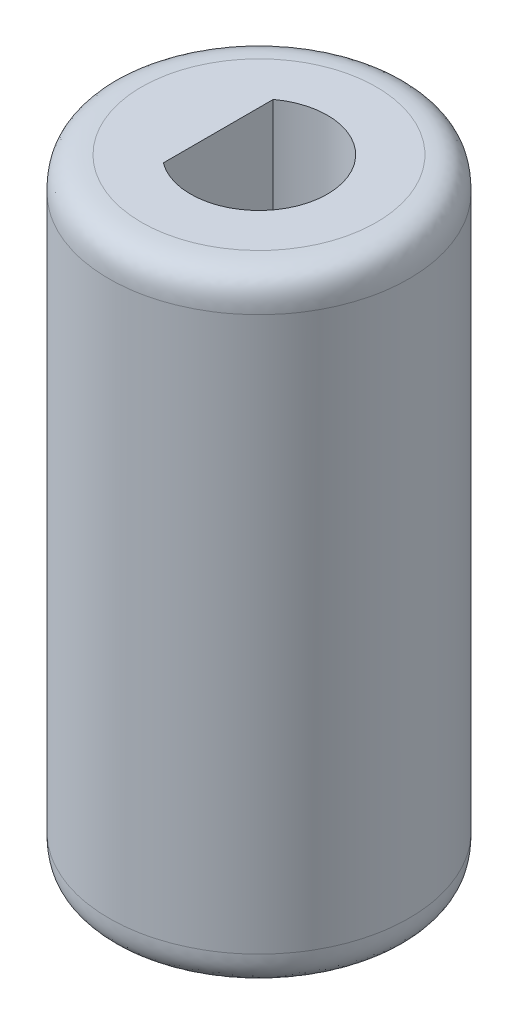
ISO-10303-21;
HEADER;
FILE_DESCRIPTION(('STEP AP214'),'2;1');
FILE_NAME('part.step','',(''),(''),'','','');
FILE_SCHEMA(('AUTOMOTIVE_DESIGN { 1 0 10303 214 1 1 1 1 }'));
ENDSEC;
DATA;
#1=APPLICATION_CONTEXT('core data for automotive mechanical design processes');
#2=APPLICATION_PROTOCOL_DEFINITION('international standard','automotive_design',2000,#1);
#3=PRODUCT_CONTEXT('',#1,'mechanical');
#4=PRODUCT('Part','Part','',(#3));
#5=PRODUCT_RELATED_PRODUCT_CATEGORY('part','',(#4));
#6=PRODUCT_DEFINITION_FORMATION('','',#4);
#7=PRODUCT_DEFINITION_CONTEXT('part definition',#1,'design');
#8=PRODUCT_DEFINITION('design','',#6,#7);
#9=PRODUCT_DEFINITION_SHAPE('','',#8);
#10=(LENGTH_UNIT() NAMED_UNIT(*) SI_UNIT(.MILLI.,.METRE.));
#11=(NAMED_UNIT(*) PLANE_ANGLE_UNIT() SI_UNIT($,.RADIAN.));
#12=(NAMED_UNIT(*) SI_UNIT($,.STERADIAN.) SOLID_ANGLE_UNIT());
#13=UNCERTAINTY_MEASURE_WITH_UNIT(LENGTH_MEASURE(1.E-05),#10,'distance_accuracy_value','');
#14=(GEOMETRIC_REPRESENTATION_CONTEXT(3) GLOBAL_UNCERTAINTY_ASSIGNED_CONTEXT((#13)) GLOBAL_UNIT_ASSIGNED_CONTEXT((#10,
#11,#12)) REPRESENTATION_CONTEXT('',''));
#15=CARTESIAN_POINT('',(0.,0.,0.));
#16=DIRECTION('',(0.,0.,1.));
#17=DIRECTION('',(1.,0.,0.));
#18=AXIS2_PLACEMENT_3D('',#15,#16,#17);
#19=CARTESIAN_POINT('',(0.,38.,0.));
#20=DIRECTION('',(0.,1.,0.));
#21=DIRECTION('',(-1.,0.,0.));
#22=AXIS2_PLACEMENT_3D('',#19,#20,#21);
#23=CYLINDRICAL_SURFACE('',#22,5.207);
#24=CARTESIAN_POINT('',(0.,0.,0.));
#25=DIRECTION('',(0.,1.,0.));
#26=DIRECTION('',(-1.,0.,0.));
#27=AXIS2_PLACEMENT_3D('',#24,#25,#26);
#28=CIRCLE('',#27,5.207);
#29=CARTESIAN_POINT('',(4.191,0.,-3.09004336539149));
#30=VERTEX_POINT('',#29);
#31=CARTESIAN_POINT('',(4.191,0.,3.09004336539149));
#32=VERTEX_POINT('',#31);
#33=EDGE_CURVE('E102',#30,#32,#28,.T.);
#34=ORIENTED_EDGE('',*,*,#33,.F.);
#35=DIRECTION('',(0.,1.,0.));
#36=VECTOR('',#35,1.);
#37=CARTESIAN_POINT('',(4.191,-6.26304462701648,-3.09004336539149));
#38=LINE('',#37,#36);
#39=CARTESIAN_POINT('',(4.191,18.,-3.09004336539149));
#40=VERTEX_POINT('',#39);
#41=EDGE_CURVE('E93',#30,#40,#38,.T.);
#42=ORIENTED_EDGE('',*,*,#41,.T.);
#43=CARTESIAN_POINT('',(0.,18.,0.));
#44=DIRECTION('',(0.,1.,0.));
#45=DIRECTION('',(-1.,0.,0.));
#46=AXIS2_PLACEMENT_3D('',#43,#44,#45);
#47=CIRCLE('',#46,5.207);
#48=CARTESIAN_POINT('',(4.191,18.,3.09004336539149));
#49=VERTEX_POINT('',#48);
#50=EDGE_CURVE('E104',#40,#49,#47,.T.);
#51=ORIENTED_EDGE('',*,*,#50,.T.);
#52=DIRECTION('',(0.,1.,0.));
#53=VECTOR('',#52,1.);
#54=CARTESIAN_POINT('',(4.191,-6.26304462701648,3.09004336539149));
#55=LINE('',#54,#53);
#56=EDGE_CURVE('E65',#32,#49,#55,.T.);
#57=ORIENTED_EDGE('',*,*,#56,.F.);
#58=EDGE_LOOP('',(#34,#42,#51,#57));
#59=FACE_BOUND('',#58,.T.);
#60=ADVANCED_FACE('F43',(#59),#23,.F.);
#61=CARTESIAN_POINT('',(-5.207,18.,0.));
#62=DIRECTION('',(0.,-1.,0.));
#63=DIRECTION('',(1.,0.,0.));
#64=AXIS2_PLACEMENT_3D('',#61,#62,#63);
#65=PLANE('',#64);
#66=ORIENTED_EDGE('',*,*,#50,.F.);
#67=DIRECTION('',(0.,0.,-1.));
#68=VECTOR('',#67,1.);
#69=CARTESIAN_POINT('',(4.191,18.,0.));
#70=LINE('',#69,#68);
#71=EDGE_CURVE('E98',#49,#40,#70,.T.);
#72=ORIENTED_EDGE('',*,*,#71,.F.);
#73=EDGE_LOOP('',(#66,#72));
#74=FACE_BOUND('',#73,.T.);
#75=ADVANCED_FACE('F147',(#74),#65,.T.);
#76=CARTESIAN_POINT('',(-4.2,20.,0.));
#77=DIRECTION('',(0.,1.,0.));
#78=DIRECTION('',(-1.,0.,0.));
#79=AXIS2_PLACEMENT_3D('',#76,#77,#78);
#80=PLANE('',#79);
#81=CARTESIAN_POINT('',(0.,20.,0.));
#82=DIRECTION('',(0.,1.,0.));
#83=DIRECTION('',(-1.,0.,0.));
#84=AXIS2_PLACEMENT_3D('',#81,#82,#83);
#85=CIRCLE('',#84,4.2);
#86=CARTESIAN_POINT('',(-2.5,20.,3.37490740613724));
#87=VERTEX_POINT('',#86);
#88=CARTESIAN_POINT('',(-2.5,20.,-3.37490740613724));
#89=VERTEX_POINT('',#88);
#90=EDGE_CURVE('E115',#87,#89,#85,.T.);
#91=ORIENTED_EDGE('',*,*,#90,.T.);
#92=DIRECTION('',(0.,0.,-1.));
#93=VECTOR('',#92,1.);
#94=CARTESIAN_POINT('',(-2.5,20.,-3.37490740613724));
#95=LINE('',#94,#93);
#96=EDGE_CURVE('E234',#87,#89,#95,.T.);
#97=ORIENTED_EDGE('',*,*,#96,.F.);
#98=EDGE_LOOP('',(#91,#97));
#99=FACE_BOUND('',#98,.T.);
#100=ADVANCED_FACE('F144',(#99),#80,.T.);
#101=CARTESIAN_POINT('',(0.,38.,0.));
#102=DIRECTION('',(0.,1.,0.));
#103=DIRECTION('',(-1.,0.,0.));
#104=AXIS2_PLACEMENT_3D('',#101,#102,#103);
#105=CYLINDRICAL_SURFACE('',#104,4.2);
#106=ORIENTED_EDGE('',*,*,#90,.F.);
#107=DIRECTION('',(0.,-1.,0.));
#108=VECTOR('',#107,1.);
#109=CARTESIAN_POINT('',(-2.5,44.9606034221179,3.37490740613724));
#110=LINE('',#109,#108);
#111=CARTESIAN_POINT('',(-2.5,38.,3.37490740613724));
#112=VERTEX_POINT('',#111);
#113=EDGE_CURVE('E230',#112,#87,#110,.T.);
#114=ORIENTED_EDGE('',*,*,#113,.F.);
#115=CARTESIAN_POINT('',(0.,38.,0.));
#116=DIRECTION('',(0.,1.,0.));
#117=DIRECTION('',(-1.,0.,0.));
#118=AXIS2_PLACEMENT_3D('',#115,#116,#117);
#119=CIRCLE('',#118,4.2);
#120=CARTESIAN_POINT('',(-2.5,38.,-3.37490740613724));
#121=VERTEX_POINT('',#120);
#122=EDGE_CURVE('E233',#112,#121,#119,.T.);
#123=ORIENTED_EDGE('',*,*,#122,.T.);
#124=DIRECTION('',(0.,-1.,0.));
#125=VECTOR('',#124,1.);
#126=CARTESIAN_POINT('',(-2.5,44.9606034221179,-3.37490740613724));
#127=LINE('',#126,#125);
#128=EDGE_CURVE('E73',#121,#89,#127,.T.);
#129=ORIENTED_EDGE('',*,*,#128,.T.);
#130=EDGE_LOOP('',(#106,#114,#123,#129));
#131=FACE_BOUND('',#130,.T.);
#132=ADVANCED_FACE('F141',(#131),#105,.F.);
#133=CARTESIAN_POINT('',(-9.207,0.,0.));
#134=DIRECTION('',(0.,-1.,0.));
#135=DIRECTION('',(1.,0.,0.));
#136=AXIS2_PLACEMENT_3D('',#133,#134,#135);
#137=PLANE('',#136);
#138=CARTESIAN_POINT('',(-7.207,0.,0.));
#139=CARTESIAN_POINT('',(-7.207,0.,0.943267144349957));
#140=CARTESIAN_POINT('',(-6.8317449984918,0.,2.82980143304989));
#141=CARTESIAN_POINT('',(-5.22879125013176,0.,5.22879125013175));
#142=CARTESIAN_POINT('',(-2.82980143304987,0.,6.83174499849181));
#143=CARTESIAN_POINT('',(0.,0.,7.3946275007541));
#144=CARTESIAN_POINT('',(2.82980143304986,0.,6.83174499849181));
#145=CARTESIAN_POINT('',(5.22879125013176,0.,5.22879125013176));
#146=CARTESIAN_POINT('',(6.83174499849181,0.,2.82980143304987));
#147=CARTESIAN_POINT('',(7.3946275007541,0.,0.));
#148=CARTESIAN_POINT('',(6.83174499849181,0.,-2.82980143304986));
#149=CARTESIAN_POINT('',(5.22879125013176,0.,-5.22879125013175));
#150=CARTESIAN_POINT('',(2.82980143304986,0.,-6.8317449984918));
#151=CARTESIAN_POINT('',(0.,0.,-7.3946275007541));
#152=CARTESIAN_POINT('',(-2.82980143304989,0.,-6.8317449984918));
#153=CARTESIAN_POINT('',(-5.22879125013174,0.,-5.22879125013177));
#154=CARTESIAN_POINT('',(-6.83174499849182,0.,-2.82980143304985));
#155=CARTESIAN_POINT('',(-7.20700000000001,0.,-0.943267144349954));
#156=CARTESIAN_POINT('',(-7.207,0.,0.));
#157=B_SPLINE_CURVE_WITH_KNOTS('',3,(#138,#139,#140,#141,#142,#143,#144,#145,#146,#147,#148,
#149,#150,#151,#152,#153,#154,#155,#156),.UNSPECIFIED.,.T.,.F.,(4,1,1,1,1,1,1,1,1,1,1,1,1,1,1,1,
4),(-3.14159265358979,-2.74889357189107,-2.35619449019234,-1.96349540849362,-1.5707963267949,
-1.17809724509617,-0.785398163397448,-0.392699081698724,0.,0.392699081698724,0.785398163397448,
1.17809724509617,1.5707963267949,1.96349540849362,2.35619449019235,2.74889357189107,
3.14159265358979),.UNSPECIFIED.);
#158=CARTESIAN_POINT('',(-7.207,0.,0.));
#159=VERTEX_POINT('',#158);
#160=EDGE_CURVE('E11',#159,#159,#157,.F.);
#161=ORIENTED_EDGE('',*,*,#160,.T.);
#162=EDGE_LOOP('',(#161));
#163=FACE_BOUND('',#162,.T.);
#164=ORIENTED_EDGE('',*,*,#33,.T.);
#165=DIRECTION('',(0.,0.,-1.));
#166=VECTOR('',#165,1.);
#167=CARTESIAN_POINT('',(4.191,0.,0.));
#168=LINE('',#167,#166);
#169=EDGE_CURVE('E90',#32,#30,#168,.T.);
#170=ORIENTED_EDGE('',*,*,#169,.T.);
#171=EDGE_LOOP('',(#164,#170));
#172=FACE_BOUND('',#171,.T.);
#173=ADVANCED_FACE('F107',(#163,#172),#137,.T.);
#174=CARTESIAN_POINT('',(-9.207,38.,0.));
#175=DIRECTION('',(0.,1.,0.));
#176=DIRECTION('',(-1.,0.,0.));
#177=AXIS2_PLACEMENT_3D('',#174,#175,#176);
#178=PLANE('',#177);
#179=CARTESIAN_POINT('',(-7.20700000000001,38.,0.));
#180=CARTESIAN_POINT('',(-7.207,38.,-0.943267144349956));
#181=CARTESIAN_POINT('',(-6.83174499849181,38.,-2.82980143304987));
#182=CARTESIAN_POINT('',(-5.22879125013174,38.,-5.22879125013178));
#183=CARTESIAN_POINT('',(-2.82980143304984,38.,-6.83174499849181));
#184=CARTESIAN_POINT('',(0.,38.,-7.39462750075411));
#185=CARTESIAN_POINT('',(2.82980143304989,38.,-6.8317449984918));
#186=CARTESIAN_POINT('',(5.22879125013175,38.,-5.22879125013177));
#187=CARTESIAN_POINT('',(6.83174499849182,38.,-2.82980143304985));
#188=CARTESIAN_POINT('',(7.3946275007541,38.,0.));
#189=CARTESIAN_POINT('',(6.8317449984918,38.,2.82980143304989));
#190=CARTESIAN_POINT('',(5.22879125013176,38.,5.22879125013175));
#191=CARTESIAN_POINT('',(2.82980143304987,38.,6.83174499849181));
#192=CARTESIAN_POINT('',(0.,38.,7.3946275007541));
#193=CARTESIAN_POINT('',(-2.82980143304986,38.,6.83174499849181));
#194=CARTESIAN_POINT('',(-5.22879125013176,38.,5.22879125013176));
#195=CARTESIAN_POINT('',(-6.83174499849181,38.,2.82980143304987));
#196=CARTESIAN_POINT('',(-7.20700000000001,38.,0.943267144349956));
#197=CARTESIAN_POINT('',(-7.20700000000001,38.,0.));
#198=B_SPLINE_CURVE_WITH_KNOTS('',3,(#179,#180,#181,#182,#183,#184,#185,#186,#187,#188,#189,
#190,#191,#192,#193,#194,#195,#196,#197),.UNSPECIFIED.,.T.,.F.,(4,1,1,1,1,1,1,1,1,1,1,1,1,1,1,1,
4),(0.,0.392699081698724,0.785398163397448,1.17809724509617,1.5707963267949,1.96349540849362,
2.35619449019235,2.74889357189107,3.14159265358979,3.53429173528852,3.92699081698724,
4.31968989868597,4.71238898038469,5.10508806208341,5.49778714378214,5.89048622548086,
6.28318530717959),.UNSPECIFIED.);
#199=CARTESIAN_POINT('',(-7.20700000000001,38.,0.));
#200=VERTEX_POINT('',#199);
#201=EDGE_CURVE('E109',#200,#200,#198,.F.);
#202=ORIENTED_EDGE('',*,*,#201,.T.);
#203=EDGE_LOOP('',(#202));
#204=FACE_BOUND('',#203,.T.);
#205=ORIENTED_EDGE('',*,*,#122,.F.);
#206=DIRECTION('',(0.,0.,-1.));
#207=VECTOR('',#206,1.);
#208=CARTESIAN_POINT('',(-2.5,38.,-3.37490740613724));
#209=LINE('',#208,#207);
#210=EDGE_CURVE('E227',#112,#121,#209,.T.);
#211=ORIENTED_EDGE('',*,*,#210,.T.);
#212=EDGE_LOOP('',(#205,#211));
#213=FACE_BOUND('',#212,.T.);
#214=ADVANCED_FACE('F128',(#204,#213),#178,.T.);
#215=CARTESIAN_POINT('',(0.,38.,0.));
#216=DIRECTION('',(0.,1.,0.));
#217=DIRECTION('',(-1.,0.,0.));
#218=AXIS2_PLACEMENT_3D('',#215,#216,#217);
#219=CYLINDRICAL_SURFACE('',#218,9.207);
#220=CARTESIAN_POINT('',(-9.207,36.,0.));
#221=CARTESIAN_POINT('',(-9.207,36.,1.20503130262662));
#222=CARTESIAN_POINT('',(-8.7276087416559,36.,3.61509390787985));
#223=CARTESIAN_POINT('',(-6.67982253919288,36.,6.67982253919288));
#224=CARTESIAN_POINT('',(-3.61509390787985,36.,8.7276087416559));
#225=CARTESIAN_POINT('',(0.,36.,9.44669562917206));
#226=CARTESIAN_POINT('',(3.61509390787986,36.,8.7276087416559));
#227=CARTESIAN_POINT('',(6.67982253919289,36.,6.67982253919287));
#228=CARTESIAN_POINT('',(8.72760874165589,36.,3.61509390787988));
#229=CARTESIAN_POINT('',(9.44669562917205,36.,0.));
#230=CARTESIAN_POINT('',(8.72760874165591,36.,-3.61509390787983));
#231=CARTESIAN_POINT('',(6.67982253919287,36.,-6.6798225391929));
#232=CARTESIAN_POINT('',(3.61509390787988,36.,-8.72760874165588));
#233=CARTESIAN_POINT('',(0.,36.,-9.44669562917206));
#234=CARTESIAN_POINT('',(-3.61509390787983,36.,-8.7276087416559));
#235=CARTESIAN_POINT('',(-6.67982253919286,36.,-6.67982253919291));
#236=CARTESIAN_POINT('',(-8.7276087416559,36.,-3.61509390787986));
#237=CARTESIAN_POINT('',(-9.207,36.,-1.20503130262662));
#238=CARTESIAN_POINT('',(-9.207,36.,0.));
#239=B_SPLINE_CURVE_WITH_KNOTS('',3,(#220,#221,#222,#223,#224,#225,#226,#227,#228,#229,#230,
#231,#232,#233,#234,#235,#236,#237,#238),.UNSPECIFIED.,.T.,.F.,(4,1,1,1,1,1,1,1,1,1,1,1,1,1,1,1,
4),(0.,0.392699081698724,0.785398163397448,1.17809724509617,1.5707963267949,1.96349540849362,
2.35619449019234,2.74889357189107,3.14159265358979,3.53429173528852,3.92699081698724,
4.31968989868597,4.71238898038469,5.10508806208341,5.49778714378214,5.89048622548086,
6.28318530717959),.UNSPECIFIED.);
#240=CARTESIAN_POINT('',(-9.207,36.,0.));
#241=VERTEX_POINT('',#240);
#242=EDGE_CURVE('E58',#241,#241,#239,.F.);
#243=ORIENTED_EDGE('',*,*,#242,.T.);
#244=EDGE_LOOP('',(#243));
#245=FACE_BOUND('',#244,.T.);
#246=CARTESIAN_POINT('',(-9.207,2.,0.));
#247=CARTESIAN_POINT('',(-9.20700000000001,2.,-1.20503130262662));
#248=CARTESIAN_POINT('',(-8.72760874165591,2.,-3.61509390787983));
#249=CARTESIAN_POINT('',(-6.67982253919286,2.,-6.6798225391929));
#250=CARTESIAN_POINT('',(-3.61509390787988,2.,-8.72760874165588));
#251=CARTESIAN_POINT('',(0.,2.,-9.44669562917206));
#252=CARTESIAN_POINT('',(3.61509390787985,2.,-8.7276087416559));
#253=CARTESIAN_POINT('',(6.67982253919289,2.,-6.67982253919288));
#254=CARTESIAN_POINT('',(8.72760874165589,2.,-3.61509390787985));
#255=CARTESIAN_POINT('',(9.44669562917206,2.,0.));
#256=CARTESIAN_POINT('',(8.7276087416559,2.,3.61509390787986));
#257=CARTESIAN_POINT('',(6.67982253919288,2.,6.67982253919288));
#258=CARTESIAN_POINT('',(3.61509390787985,2.,8.7276087416559));
#259=CARTESIAN_POINT('',(0.,2.,9.44669562917206));
#260=CARTESIAN_POINT('',(-3.61509390787986,2.,8.7276087416559));
#261=CARTESIAN_POINT('',(-6.67982253919289,2.,6.67982253919287));
#262=CARTESIAN_POINT('',(-8.72760874165589,2.,3.61509390787988));
#263=CARTESIAN_POINT('',(-9.207,2.,1.20503130262662));
#264=CARTESIAN_POINT('',(-9.207,2.,0.));
#265=B_SPLINE_CURVE_WITH_KNOTS('',3,(#246,#247,#248,#249,#250,#251,#252,#253,#254,#255,#256,
#257,#258,#259,#260,#261,#262,#263,#264),.UNSPECIFIED.,.T.,.F.,(4,1,1,1,1,1,1,1,1,1,1,1,1,1,1,1,
4),(-3.14159265358979,-2.74889357189107,-2.35619449019235,-1.96349540849362,-1.5707963267949,
-1.17809724509617,-0.785398163397448,-0.392699081698724,0.,0.392699081698724,0.785398163397448,
1.17809724509617,1.5707963267949,1.96349540849362,2.35619449019234,2.74889357189107,
3.14159265358979),.UNSPECIFIED.);
#266=CARTESIAN_POINT('',(-9.207,2.,0.));
#267=VERTEX_POINT('',#266);
#268=EDGE_CURVE('E114',#267,#267,#265,.F.);
#269=ORIENTED_EDGE('',*,*,#268,.T.);
#270=EDGE_LOOP('',(#269));
#271=FACE_BOUND('',#270,.T.);
#272=ADVANCED_FACE('F138',(#245,#271),#219,.T.);
#273=CARTESIAN_POINT('',(-2.5,44.9606034221179,-3.37490740613724));
#274=DIRECTION('',(-1.,0.,0.));
#275=DIRECTION('',(0.,-1.,0.));
#276=AXIS2_PLACEMENT_3D('',#273,#274,#275);
#277=PLANE('',#276);
#278=ORIENTED_EDGE('',*,*,#210,.F.);
#279=ORIENTED_EDGE('',*,*,#113,.T.);
#280=ORIENTED_EDGE('',*,*,#96,.T.);
#281=ORIENTED_EDGE('',*,*,#128,.F.);
#282=EDGE_LOOP('',(#278,#279,#280,#281));
#283=FACE_BOUND('',#282,.T.);
#284=ADVANCED_FACE('F214',(#283),#277,.F.);
#285=CARTESIAN_POINT('',(4.191,-6.26304462701648,0.));
#286=DIRECTION('',(1.,0.,0.));
#287=DIRECTION('',(0.,1.,0.));
#288=AXIS2_PLACEMENT_3D('',#285,#286,#287);
#289=PLANE('',#288);
#290=ORIENTED_EDGE('',*,*,#169,.F.);
#291=ORIENTED_EDGE('',*,*,#56,.T.);
#292=ORIENTED_EDGE('',*,*,#71,.T.);
#293=ORIENTED_EDGE('',*,*,#41,.F.);
#294=EDGE_LOOP('',(#290,#291,#292,#293));
#295=FACE_BOUND('',#294,.T.);
#296=ADVANCED_FACE('F91',(#295),#289,.F.);
#297=CARTESIAN_POINT('',(-7.20700000000001,38.,0.));
#298=CARTESIAN_POINT('',(-7.20700000000001,38.,0.943267144349956));
#299=CARTESIAN_POINT('',(-6.83174499849181,38.,2.82980143304987));
#300=CARTESIAN_POINT('',(-5.22879125013176,38.,5.22879125013176));
#301=CARTESIAN_POINT('',(-2.82980143304986,38.,6.83174499849181));
#302=CARTESIAN_POINT('',(0.,38.,7.3946275007541));
#303=CARTESIAN_POINT('',(2.82980143304987,38.,6.83174499849181));
#304=CARTESIAN_POINT('',(5.22879125013176,38.,5.22879125013175));
#305=CARTESIAN_POINT('',(6.8317449984918,38.,2.82980143304989));
#306=CARTESIAN_POINT('',(7.3946275007541,38.,0.));
#307=CARTESIAN_POINT('',(6.83174499849182,38.,-2.82980143304985));
#308=CARTESIAN_POINT('',(5.22879125013175,38.,-5.22879125013177));
#309=CARTESIAN_POINT('',(2.82980143304989,38.,-6.8317449984918));
#310=CARTESIAN_POINT('',(0.,38.,-7.39462750075411));
#311=CARTESIAN_POINT('',(-2.82980143304984,38.,-6.83174499849181));
#312=CARTESIAN_POINT('',(-5.22879125013174,38.,-5.22879125013178));
#313=CARTESIAN_POINT('',(-6.83174499849181,38.,-2.82980143304987));
#314=CARTESIAN_POINT('',(-7.207,38.,-0.943267144349956));
#315=CARTESIAN_POINT('',(-7.20700000000001,38.,0.));
#316=CARTESIAN_POINT('',(-7.5433961030679,38.,0.));
#317=CARTESIAN_POINT('',(-7.5433961030679,38.,0.987295365733515));
#318=CARTESIAN_POINT('',(-7.15062558606586,38.,2.96188609720054));
#319=CARTESIAN_POINT('',(-5.47285188566663,38.,5.47285188566663));
#320=CARTESIAN_POINT('',(-2.96188609720053,38.,7.15062558606586));
#321=CARTESIAN_POINT('',(0.,38.,7.73978136156891));
#322=CARTESIAN_POINT('',(2.96188609720054,38.,7.15062558606586));
#323=CARTESIAN_POINT('',(5.47285188566664,38.,5.47285188566662));
#324=CARTESIAN_POINT('',(7.15062558606585,38.,2.96188609720056));
#325=CARTESIAN_POINT('',(7.73978136156891,38.,0.));
#326=CARTESIAN_POINT('',(7.15062558606587,38.,-2.96188609720052));
#327=CARTESIAN_POINT('',(5.47285188566662,38.,-5.47285188566664));
#328=CARTESIAN_POINT('',(2.96188609720056,38.,-7.15062558606585));
#329=CARTESIAN_POINT('',(0.,38.,-7.73978136156892));
#330=CARTESIAN_POINT('',(-2.96188609720052,38.,-7.15062558606586));
#331=CARTESIAN_POINT('',(-5.47285188566662,38.,-5.47285188566665));
#332=CARTESIAN_POINT('',(-7.15062558606586,38.,-2.96188609720055));
#333=CARTESIAN_POINT('',(-7.5433961030679,38.,-0.987295365733515));
#334=CARTESIAN_POINT('',(-7.5433961030679,38.,0.));
#335=CARTESIAN_POINT('',(-7.87979220613579,38.,0.));
#336=CARTESIAN_POINT('',(-7.87979220613579,38.,1.03132358711707));
#337=CARTESIAN_POINT('',(-7.46950617363992,38.,3.09397076135122));
#338=CARTESIAN_POINT('',(-5.7169125212015,38.,5.7169125212015));
#339=CARTESIAN_POINT('',(-3.09397076135121,38.,7.46950617363991));
#340=CARTESIAN_POINT('',(0.,38.,8.08493522238373));
#341=CARTESIAN_POINT('',(3.09397076135122,38.,7.46950617363992));
#342=CARTESIAN_POINT('',(5.71691252120151,38.,5.71691252120149));
#343=CARTESIAN_POINT('',(7.46950617363991,38.,3.09397076135124));
#344=CARTESIAN_POINT('',(8.08493522238373,38.,0.));
#345=CARTESIAN_POINT('',(7.46950617363993,38.,-3.09397076135119));
#346=CARTESIAN_POINT('',(5.71691252120149,38.,-5.71691252120152));
#347=CARTESIAN_POINT('',(3.09397076135124,38.,-7.46950617363991));
#348=CARTESIAN_POINT('',(0.,38.,-8.08493522238373));
#349=CARTESIAN_POINT('',(-3.09397076135119,38.,-7.46950617363992));
#350=CARTESIAN_POINT('',(-5.71691252120149,38.,-5.71691252120153));
#351=CARTESIAN_POINT('',(-7.46950617363991,38.,-3.09397076135122));
#352=CARTESIAN_POINT('',(-7.87979220613579,38.,-1.03132358711707));
#353=CARTESIAN_POINT('',(-7.87979220613579,38.,0.));
#354=CARTESIAN_POINT('',(-8.6212135623731,37.8566161603278,0.));
#355=CARTESIAN_POINT('',(-8.6212135623731,37.8566161603278,1.12836235573897));
#356=CARTESIAN_POINT('',(-8.17232310748885,37.8566161603278,3.38508706721692));
#357=CARTESIAN_POINT('',(-6.25482531434074,37.8566161603278,6.25482531434074));
#358=CARTESIAN_POINT('',(-3.38508706721691,37.8566161603278,8.17232310748885));
#359=CARTESIAN_POINT('',(0.,37.8566161603278,8.84565878981523));
#360=CARTESIAN_POINT('',(3.38508706721692,37.8566161603278,8.17232310748886));
#361=CARTESIAN_POINT('',(6.25482531434074,37.8566161603278,6.25482531434072));
#362=CARTESIAN_POINT('',(8.17232310748884,37.8566161603279,3.38508706721694));
#363=CARTESIAN_POINT('',(8.84565878981523,37.8566161603278,0.));
#364=CARTESIAN_POINT('',(8.17232310748886,37.8566161603278,-3.38508706721689));
#365=CARTESIAN_POINT('',(6.25482531434072,37.8566161603278,-6.25482531434075));
#366=CARTESIAN_POINT('',(3.38508706721694,37.8566161603278,-8.17232310748883));
#367=CARTESIAN_POINT('',(0.,37.8566161603279,-8.84565878981523));
#368=CARTESIAN_POINT('',(-3.38508706721689,37.8566161603278,-8.17232310748885));
#369=CARTESIAN_POINT('',(-6.25482531434072,37.8566161603279,-6.25482531434076));
#370=CARTESIAN_POINT('',(-8.17232310748885,37.8566161603278,-3.38508706721692));
#371=CARTESIAN_POINT('',(-8.6212135623731,37.8566161603278,-1.12836235573897));
#372=CARTESIAN_POINT('',(-8.6212135623731,37.8566161603278,0.));
#373=CARTESIAN_POINT('',(-9.06361616032783,37.4142135623731,0.));
#374=CARTESIAN_POINT('',(-9.06361616032784,37.4142135623731,1.18626492757549));
#375=CARTESIAN_POINT('',(-8.59169063016083,37.4142135623731,3.55879478272646));
#376=CARTESIAN_POINT('',(-6.57579532033786,37.4142135623731,6.57579532033786));
#377=CARTESIAN_POINT('',(-3.55879478272645,37.4142135623731,8.59169063016084));
#378=CARTESIAN_POINT('',(0.,37.4142135623731,9.29957892541133));
#379=CARTESIAN_POINT('',(3.55879478272646,37.4142135623731,8.59169063016084));
#380=CARTESIAN_POINT('',(6.57579532033787,37.4142135623731,6.57579532033784));
#381=CARTESIAN_POINT('',(8.59169063016082,37.4142135623731,3.55879478272649));
#382=CARTESIAN_POINT('',(9.29957892541133,37.4142135623731,0.));
#383=CARTESIAN_POINT('',(8.59169063016084,37.4142135623731,-3.55879478272644));
#384=CARTESIAN_POINT('',(6.57579532033784,37.4142135623731,-6.57579532033788));
#385=CARTESIAN_POINT('',(3.55879478272649,37.4142135623731,-8.59169063016082));
#386=CARTESIAN_POINT('',(0.,37.4142135623731,-9.29957892541134));
#387=CARTESIAN_POINT('',(-3.55879478272643,37.4142135623731,-8.59169063016084));
#388=CARTESIAN_POINT('',(-6.57579532033785,37.4142135623731,-6.57579532033789));
#389=CARTESIAN_POINT('',(-8.59169063016083,37.4142135623731,-3.55879478272646));
#390=CARTESIAN_POINT('',(-9.06361616032783,37.4142135623731,-1.18626492757549));
#391=CARTESIAN_POINT('',(-9.06361616032783,37.4142135623731,0.));
#392=CARTESIAN_POINT('',(-9.207,36.6727922061358,0.));
#393=CARTESIAN_POINT('',(-9.207,36.6727922061358,1.20503130262662));
#394=CARTESIAN_POINT('',(-8.7276087416559,36.6727922061358,3.61509390787985));
#395=CARTESIAN_POINT('',(-6.67982253919288,36.6727922061358,6.67982253919288));
#396=CARTESIAN_POINT('',(-3.61509390787985,36.6727922061358,8.7276087416559));
#397=CARTESIAN_POINT('',(0.,36.6727922061358,9.44669562917206));
#398=CARTESIAN_POINT('',(3.61509390787986,36.6727922061358,8.7276087416559));
#399=CARTESIAN_POINT('',(6.67982253919289,36.6727922061358,6.67982253919287));
#400=CARTESIAN_POINT('',(8.72760874165589,36.6727922061358,3.61509390787988));
#401=CARTESIAN_POINT('',(9.44669562917205,36.6727922061358,0.));
#402=CARTESIAN_POINT('',(8.72760874165591,36.6727922061358,-3.61509390787983));
#403=CARTESIAN_POINT('',(6.67982253919287,36.6727922061358,-6.6798225391929));
#404=CARTESIAN_POINT('',(3.61509390787988,36.6727922061358,-8.72760874165588));
#405=CARTESIAN_POINT('',(0.,36.6727922061358,-9.44669562917206));
#406=CARTESIAN_POINT('',(-3.61509390787983,36.6727922061358,-8.7276087416559));
#407=CARTESIAN_POINT('',(-6.67982253919286,36.6727922061358,-6.67982253919291));
#408=CARTESIAN_POINT('',(-8.7276087416559,36.6727922061358,-3.61509390787986));
#409=CARTESIAN_POINT('',(-9.207,36.6727922061358,-1.20503130262662));
#410=CARTESIAN_POINT('',(-9.207,36.6727922061358,0.));
#411=CARTESIAN_POINT('',(-9.207,36.3363961030679,0.));
#412=CARTESIAN_POINT('',(-9.207,36.3363961030679,1.20503130262662));
#413=CARTESIAN_POINT('',(-8.7276087416559,36.3363961030679,3.61509390787985));
#414=CARTESIAN_POINT('',(-6.67982253919288,36.3363961030679,6.67982253919288));
#415=CARTESIAN_POINT('',(-3.61509390787985,36.3363961030679,8.7276087416559));
#416=CARTESIAN_POINT('',(0.,36.3363961030679,9.44669562917206));
#417=CARTESIAN_POINT('',(3.61509390787986,36.3363961030679,8.7276087416559));
#418=CARTESIAN_POINT('',(6.67982253919289,36.3363961030679,6.67982253919287));
#419=CARTESIAN_POINT('',(8.72760874165589,36.3363961030679,3.61509390787988));
#420=CARTESIAN_POINT('',(9.44669562917205,36.3363961030679,0.));
#421=CARTESIAN_POINT('',(8.72760874165591,36.3363961030679,-3.61509390787983));
#422=CARTESIAN_POINT('',(6.67982253919287,36.3363961030679,-6.6798225391929));
#423=CARTESIAN_POINT('',(3.61509390787988,36.3363961030679,-8.72760874165588));
#424=CARTESIAN_POINT('',(0.,36.3363961030679,-9.44669562917206));
#425=CARTESIAN_POINT('',(-3.61509390787983,36.3363961030679,-8.7276087416559));
#426=CARTESIAN_POINT('',(-6.67982253919286,36.3363961030679,-6.67982253919291));
#427=CARTESIAN_POINT('',(-8.7276087416559,36.3363961030679,-3.61509390787986));
#428=CARTESIAN_POINT('',(-9.207,36.3363961030679,-1.20503130262662));
#429=CARTESIAN_POINT('',(-9.207,36.3363961030679,0.));
#430=CARTESIAN_POINT('',(-9.207,36.,0.));
#431=CARTESIAN_POINT('',(-9.207,36.,1.20503130262662));
#432=CARTESIAN_POINT('',(-8.7276087416559,36.,3.61509390787985));
#433=CARTESIAN_POINT('',(-6.67982253919288,36.,6.67982253919288));
#434=CARTESIAN_POINT('',(-3.61509390787985,36.,8.7276087416559));
#435=CARTESIAN_POINT('',(0.,36.,9.44669562917206));
#436=CARTESIAN_POINT('',(3.61509390787986,36.,8.7276087416559));
#437=CARTESIAN_POINT('',(6.67982253919289,36.,6.67982253919287));
#438=CARTESIAN_POINT('',(8.72760874165589,36.,3.61509390787988));
#439=CARTESIAN_POINT('',(9.44669562917205,36.,0.));
#440=CARTESIAN_POINT('',(8.72760874165591,36.,-3.61509390787983));
#441=CARTESIAN_POINT('',(6.67982253919287,36.,-6.6798225391929));
#442=CARTESIAN_POINT('',(3.61509390787988,36.,-8.72760874165588));
#443=CARTESIAN_POINT('',(0.,36.,-9.44669562917206));
#444=CARTESIAN_POINT('',(-3.61509390787983,36.,-8.7276087416559));
#445=CARTESIAN_POINT('',(-6.67982253919286,36.,-6.67982253919291));
#446=CARTESIAN_POINT('',(-8.7276087416559,36.,-3.61509390787986));
#447=CARTESIAN_POINT('',(-9.207,36.,-1.20503130262662));
#448=CARTESIAN_POINT('',(-9.207,36.,0.));
#449=B_SPLINE_SURFACE_WITH_KNOTS('',5,3,((#297,#298,#299,#300,#301,#302,#303,#304,#305,#306,
#307,#308,#309,#310,#311,#312,#313,#314,#315),(#316,#317,#318,#319,#320,#321,#322,#323,#324,
#325,#326,#327,#328,#329,#330,#331,#332,#333,#334),(#335,#336,#337,#338,#339,#340,#341,#342,
#343,#344,#345,#346,#347,#348,#349,#350,#351,#352,#353),(#354,#355,#356,#357,#358,#359,#360,
#361,#362,#363,#364,#365,#366,#367,#368,#369,#370,#371,#372),(#373,#374,#375,#376,#377,#378,
#379,#380,#381,#382,#383,#384,#385,#386,#387,#388,#389,#390,#391),(#392,#393,#394,#395,#396,
#397,#398,#399,#400,#401,#402,#403,#404,#405,#406,#407,#408,#409,#410),(#411,#412,#413,#414,
#415,#416,#417,#418,#419,#420,#421,#422,#423,#424,#425,#426,#427,#428,#429),(#430,#431,#432,
#433,#434,#435,#436,#437,#438,#439,#440,#441,#442,#443,#444,#445,#446,#447,#448)),.UNSPECIFIED.,
.F.,.T.,.F.,(6,2,6),(4,1,1,1,1,1,1,1,1,1,1,1,1,1,1,1,4),(0.,0.5,1.),(0.,0.392699081698724,
0.785398163397448,1.17809724509617,1.5707963267949,1.96349540849362,2.35619449019234,
2.74889357189107,3.14159265358979,3.53429173528852,3.92699081698724,4.31968989868597,
4.71238898038469,5.10508806208341,5.49778714378214,5.89048622548086,6.28318530717959),.UNSPECIFIED.);
#450=ORIENTED_EDGE('',*,*,#242,.F.);
#451=EDGE_LOOP('',(#450));
#452=FACE_BOUND('',#451,.T.);
#453=ORIENTED_EDGE('',*,*,#201,.F.);
#454=EDGE_LOOP('',(#453));
#455=FACE_BOUND('',#454,.T.);
#456=ADVANCED_FACE('F158',(#452,#455),#449,.T.);
#457=CARTESIAN_POINT('',(-7.207,0.,0.));
#458=CARTESIAN_POINT('',(-7.20700000000001,0.,-0.943267144349954));
#459=CARTESIAN_POINT('',(-6.83174499849182,0.,-2.82980143304985));
#460=CARTESIAN_POINT('',(-5.22879125013174,0.,-5.22879125013177));
#461=CARTESIAN_POINT('',(-2.82980143304989,0.,-6.8317449984918));
#462=CARTESIAN_POINT('',(0.,0.,-7.3946275007541));
#463=CARTESIAN_POINT('',(2.82980143304986,0.,-6.8317449984918));
#464=CARTESIAN_POINT('',(5.22879125013176,0.,-5.22879125013175));
#465=CARTESIAN_POINT('',(6.83174499849181,0.,-2.82980143304986));
#466=CARTESIAN_POINT('',(7.3946275007541,0.,0.));
#467=CARTESIAN_POINT('',(6.83174499849181,0.,2.82980143304987));
#468=CARTESIAN_POINT('',(5.22879125013176,0.,5.22879125013176));
#469=CARTESIAN_POINT('',(2.82980143304986,0.,6.83174499849181));
#470=CARTESIAN_POINT('',(0.,0.,7.3946275007541));
#471=CARTESIAN_POINT('',(-2.82980143304987,0.,6.83174499849181));
#472=CARTESIAN_POINT('',(-5.22879125013176,0.,5.22879125013175));
#473=CARTESIAN_POINT('',(-6.8317449984918,0.,2.82980143304989));
#474=CARTESIAN_POINT('',(-7.207,0.,0.943267144349957));
#475=CARTESIAN_POINT('',(-7.207,0.,0.));
#476=CARTESIAN_POINT('',(-7.5433961030679,0.,0.));
#477=CARTESIAN_POINT('',(-7.5433961030679,0.,-0.987295365733513));
#478=CARTESIAN_POINT('',(-7.15062558606587,0.,-2.96188609720052));
#479=CARTESIAN_POINT('',(-5.47285188566662,0.,-5.47285188566664));
#480=CARTESIAN_POINT('',(-2.96188609720056,0.,-7.15062558606585));
#481=CARTESIAN_POINT('',(0.,0.,-7.73978136156892));
#482=CARTESIAN_POINT('',(2.96188609720054,0.,-7.15062558606586));
#483=CARTESIAN_POINT('',(5.47285188566664,0.,-5.47285188566663));
#484=CARTESIAN_POINT('',(7.15062558606586,0.,-2.96188609720054));
#485=CARTESIAN_POINT('',(7.73978136156892,0.,0.));
#486=CARTESIAN_POINT('',(7.15062558606586,0.,2.96188609720054));
#487=CARTESIAN_POINT('',(5.47285188566663,0.,5.47285188566663));
#488=CARTESIAN_POINT('',(2.96188609720053,0.,7.15062558606586));
#489=CARTESIAN_POINT('',(0.,0.,7.73978136156891));
#490=CARTESIAN_POINT('',(-2.96188609720054,0.,7.15062558606586));
#491=CARTESIAN_POINT('',(-5.47285188566663,0.,5.47285188566662));
#492=CARTESIAN_POINT('',(-7.15062558606585,0.,2.96188609720056));
#493=CARTESIAN_POINT('',(-7.54339610306789,0.,0.987295365733515));
#494=CARTESIAN_POINT('',(-7.5433961030679,0.,0.));
#495=CARTESIAN_POINT('',(-7.87979220613579,0.,0.));
#496=CARTESIAN_POINT('',(-7.87979220613579,0.,-1.03132358711707));
#497=CARTESIAN_POINT('',(-7.46950617363992,0.,-3.09397076135119));
#498=CARTESIAN_POINT('',(-5.71691252120149,0.,-5.71691252120151));
#499=CARTESIAN_POINT('',(-3.09397076135124,0.,-7.4695061736399));
#500=CARTESIAN_POINT('',(0.,0.,-8.08493522238373));
#501=CARTESIAN_POINT('',(3.09397076135121,0.,-7.46950617363991));
#502=CARTESIAN_POINT('',(5.71691252120151,0.,-5.7169125212015));
#503=CARTESIAN_POINT('',(7.46950617363991,0.,-3.09397076135121));
#504=CARTESIAN_POINT('',(8.08493522238373,0.,0.));
#505=CARTESIAN_POINT('',(7.46950617363991,0.,3.09397076135122));
#506=CARTESIAN_POINT('',(5.71691252120151,0.,5.7169125212015));
#507=CARTESIAN_POINT('',(3.09397076135121,0.,7.46950617363991));
#508=CARTESIAN_POINT('',(0.,0.,8.08493522238373));
#509=CARTESIAN_POINT('',(-3.09397076135122,0.,7.46950617363992));
#510=CARTESIAN_POINT('',(-5.71691252120151,0.,5.71691252120149));
#511=CARTESIAN_POINT('',(-7.4695061736399,0.,3.09397076135124));
#512=CARTESIAN_POINT('',(-7.87979220613578,0.,1.03132358711707));
#513=CARTESIAN_POINT('',(-7.87979220613579,0.,0.));
#514=CARTESIAN_POINT('',(-8.62121356237309,0.143383839672169,0.));
#515=CARTESIAN_POINT('',(-8.6212135623731,0.143383839672169,-1.12836235573897));
#516=CARTESIAN_POINT('',(-8.17232310748886,0.143383839672167,-3.38508706721689));
#517=CARTESIAN_POINT('',(-6.25482531434072,0.143383839672169,-6.25482531434075));
#518=CARTESIAN_POINT('',(-3.38508706721694,0.143383839672168,-8.17232310748883));
#519=CARTESIAN_POINT('',(0.,0.14338383967217,-8.84565878981523));
#520=CARTESIAN_POINT('',(3.38508706721691,0.143383839672167,-8.17232310748885));
#521=CARTESIAN_POINT('',(6.25482531434074,0.14338383967217,-6.25482531434073));
#522=CARTESIAN_POINT('',(8.17232310748884,0.143383839672168,-3.38508706721692));
#523=CARTESIAN_POINT('',(8.84565878981523,0.14338383967217,0.));
#524=CARTESIAN_POINT('',(8.17232310748885,0.143383839672167,3.38508706721692));
#525=CARTESIAN_POINT('',(6.25482531434074,0.14338383967217,6.25482531434074));
#526=CARTESIAN_POINT('',(3.38508706721691,0.143383839672166,8.17232310748884));
#527=CARTESIAN_POINT('',(0.,0.14338383967217,8.84565878981523));
#528=CARTESIAN_POINT('',(-3.38508706721692,0.143383839672168,8.17232310748885));
#529=CARTESIAN_POINT('',(-6.25482531434074,0.143383839672168,6.25482531434072));
#530=CARTESIAN_POINT('',(-8.17232310748884,0.143383839672169,3.38508706721694));
#531=CARTESIAN_POINT('',(-8.62121356237309,0.143383839672169,1.12836235573897));
#532=CARTESIAN_POINT('',(-8.62121356237309,0.143383839672169,0.));
#533=CARTESIAN_POINT('',(-9.06361616032784,0.585786437626907,0.));
#534=CARTESIAN_POINT('',(-9.06361616032784,0.585786437626907,-1.18626492757549));
#535=CARTESIAN_POINT('',(-8.59169063016085,0.585786437626908,-3.55879478272644));
#536=CARTESIAN_POINT('',(-6.57579532033784,0.585786437626905,-6.57579532033788));
#537=CARTESIAN_POINT('',(-3.55879478272649,0.585786437626908,-8.59169063016082));
#538=CARTESIAN_POINT('',(0.,0.585786437626908,-9.29957892541134));
#539=CARTESIAN_POINT('',(3.55879478272646,0.585786437626906,-8.59169063016084));
#540=CARTESIAN_POINT('',(6.57579532033787,0.585786437626906,-6.57579532033785));
#541=CARTESIAN_POINT('',(8.59169063016084,0.585786437626906,-3.55879478272646));
#542=CARTESIAN_POINT('',(9.29957892541134,0.585786437626908,0.));
#543=CARTESIAN_POINT('',(8.59169063016084,0.585786437626907,3.55879478272646));
#544=CARTESIAN_POINT('',(6.57579532033786,0.585786437626905,6.57579532033786));
#545=CARTESIAN_POINT('',(3.55879478272646,0.585786437626908,8.59169063016084));
#546=CARTESIAN_POINT('',(0.,0.585786437626907,9.29957892541134));
#547=CARTESIAN_POINT('',(-3.55879478272646,0.585786437626906,8.59169063016084));
#548=CARTESIAN_POINT('',(-6.57579532033787,0.585786437626907,6.57579532033785));
#549=CARTESIAN_POINT('',(-8.59169063016083,0.585786437626908,3.55879478272649));
#550=CARTESIAN_POINT('',(-9.06361616032783,0.585786437626907,1.18626492757549));
#551=CARTESIAN_POINT('',(-9.06361616032784,0.585786437626907,0.));
#552=CARTESIAN_POINT('',(-9.207,1.32720779386422,0.));
#553=CARTESIAN_POINT('',(-9.20700000000001,1.32720779386422,-1.20503130262662));
#554=CARTESIAN_POINT('',(-8.72760874165591,1.32720779386422,-3.61509390787983));
#555=CARTESIAN_POINT('',(-6.67982253919286,1.32720779386422,-6.6798225391929));
#556=CARTESIAN_POINT('',(-3.61509390787988,1.32720779386422,-8.72760874165588));
#557=CARTESIAN_POINT('',(0.,1.32720779386422,-9.44669562917206));
#558=CARTESIAN_POINT('',(3.61509390787985,1.32720779386421,-8.7276087416559));
#559=CARTESIAN_POINT('',(6.67982253919289,1.32720779386422,-6.67982253919288));
#560=CARTESIAN_POINT('',(8.72760874165589,1.32720779386422,-3.61509390787985));
#561=CARTESIAN_POINT('',(9.44669562917206,1.32720779386422,0.));
#562=CARTESIAN_POINT('',(8.7276087416559,1.32720779386422,3.61509390787986));
#563=CARTESIAN_POINT('',(6.67982253919288,1.32720779386422,6.67982253919288));
#564=CARTESIAN_POINT('',(3.61509390787985,1.32720779386422,8.7276087416559));
#565=CARTESIAN_POINT('',(0.,1.32720779386422,9.44669562917206));
#566=CARTESIAN_POINT('',(-3.61509390787986,1.32720779386421,8.7276087416559));
#567=CARTESIAN_POINT('',(-6.67982253919289,1.32720779386422,6.67982253919287));
#568=CARTESIAN_POINT('',(-8.72760874165589,1.32720779386422,3.61509390787988));
#569=CARTESIAN_POINT('',(-9.207,1.32720779386422,1.20503130262662));
#570=CARTESIAN_POINT('',(-9.207,1.32720779386422,0.));
#571=CARTESIAN_POINT('',(-9.207,1.66360389693211,0.));
#572=CARTESIAN_POINT('',(-9.20700000000001,1.66360389693211,-1.20503130262662));
#573=CARTESIAN_POINT('',(-8.72760874165591,1.66360389693211,-3.61509390787983));
#574=CARTESIAN_POINT('',(-6.67982253919286,1.66360389693211,-6.6798225391929));
#575=CARTESIAN_POINT('',(-3.61509390787988,1.66360389693211,-8.72760874165588));
#576=CARTESIAN_POINT('',(0.,1.66360389693211,-9.44669562917206));
#577=CARTESIAN_POINT('',(3.61509390787985,1.66360389693211,-8.7276087416559));
#578=CARTESIAN_POINT('',(6.67982253919289,1.66360389693211,-6.67982253919288));
#579=CARTESIAN_POINT('',(8.72760874165589,1.66360389693211,-3.61509390787985));
#580=CARTESIAN_POINT('',(9.44669562917206,1.66360389693211,0.));
#581=CARTESIAN_POINT('',(8.7276087416559,1.66360389693211,3.61509390787986));
#582=CARTESIAN_POINT('',(6.67982253919288,1.66360389693211,6.67982253919288));
#583=CARTESIAN_POINT('',(3.61509390787985,1.66360389693211,8.7276087416559));
#584=CARTESIAN_POINT('',(0.,1.66360389693211,9.44669562917206));
#585=CARTESIAN_POINT('',(-3.61509390787986,1.66360389693211,8.7276087416559));
#586=CARTESIAN_POINT('',(-6.67982253919289,1.66360389693211,6.67982253919287));
#587=CARTESIAN_POINT('',(-8.72760874165589,1.66360389693211,3.61509390787988));
#588=CARTESIAN_POINT('',(-9.207,1.66360389693211,1.20503130262662));
#589=CARTESIAN_POINT('',(-9.207,1.66360389693211,0.));
#590=CARTESIAN_POINT('',(-9.207,2.,0.));
#591=CARTESIAN_POINT('',(-9.20700000000001,2.,-1.20503130262662));
#592=CARTESIAN_POINT('',(-8.72760874165591,2.,-3.61509390787983));
#593=CARTESIAN_POINT('',(-6.67982253919286,2.,-6.6798225391929));
#594=CARTESIAN_POINT('',(-3.61509390787988,2.,-8.72760874165588));
#595=CARTESIAN_POINT('',(0.,2.,-9.44669562917206));
#596=CARTESIAN_POINT('',(3.61509390787985,2.,-8.7276087416559));
#597=CARTESIAN_POINT('',(6.67982253919289,2.,-6.67982253919288));
#598=CARTESIAN_POINT('',(8.72760874165589,2.,-3.61509390787985));
#599=CARTESIAN_POINT('',(9.44669562917206,2.,0.));
#600=CARTESIAN_POINT('',(8.7276087416559,2.,3.61509390787986));
#601=CARTESIAN_POINT('',(6.67982253919288,2.,6.67982253919288));
#602=CARTESIAN_POINT('',(3.61509390787985,2.,8.7276087416559));
#603=CARTESIAN_POINT('',(0.,2.,9.44669562917206));
#604=CARTESIAN_POINT('',(-3.61509390787986,2.,8.7276087416559));
#605=CARTESIAN_POINT('',(-6.67982253919289,2.,6.67982253919287));
#606=CARTESIAN_POINT('',(-8.72760874165589,2.,3.61509390787988));
#607=CARTESIAN_POINT('',(-9.207,2.,1.20503130262662));
#608=CARTESIAN_POINT('',(-9.207,2.,0.));
#609=B_SPLINE_SURFACE_WITH_KNOTS('',5,3,((#457,#458,#459,#460,#461,#462,#463,#464,#465,#466,
#467,#468,#469,#470,#471,#472,#473,#474,#475),(#476,#477,#478,#479,#480,#481,#482,#483,#484,
#485,#486,#487,#488,#489,#490,#491,#492,#493,#494),(#495,#496,#497,#498,#499,#500,#501,#502,
#503,#504,#505,#506,#507,#508,#509,#510,#511,#512,#513),(#514,#515,#516,#517,#518,#519,#520,
#521,#522,#523,#524,#525,#526,#527,#528,#529,#530,#531,#532),(#533,#534,#535,#536,#537,#538,
#539,#540,#541,#542,#543,#544,#545,#546,#547,#548,#549,#550,#551),(#552,#553,#554,#555,#556,
#557,#558,#559,#560,#561,#562,#563,#564,#565,#566,#567,#568,#569,#570),(#571,#572,#573,#574,
#575,#576,#577,#578,#579,#580,#581,#582,#583,#584,#585,#586,#587,#588,#589),(#590,#591,#592,
#593,#594,#595,#596,#597,#598,#599,#600,#601,#602,#603,#604,#605,#606,#607,#608)),.UNSPECIFIED.,
.F.,.T.,.F.,(6,2,6),(4,1,1,1,1,1,1,1,1,1,1,1,1,1,1,1,4),(0.,0.5,1.),(-3.14159265358979,
-2.74889357189107,-2.35619449019235,-1.96349540849362,-1.5707963267949,-1.17809724509617,
-0.785398163397448,-0.392699081698724,0.,0.392699081698724,0.785398163397448,1.17809724509617,
1.5707963267949,1.96349540849362,2.35619449019234,2.74889357189107,3.14159265358979),.UNSPECIFIED.);
#610=ORIENTED_EDGE('',*,*,#160,.F.);
#611=EDGE_LOOP('',(#610));
#612=FACE_BOUND('',#611,.T.);
#613=ORIENTED_EDGE('',*,*,#268,.F.);
#614=EDGE_LOOP('',(#613));
#615=FACE_BOUND('',#614,.T.);
#616=ADVANCED_FACE('F46',(#612,#615),#609,.T.);
#617=CLOSED_SHELL('',(#60,#75,#100,#132,#173,#214,#272,#284,#296,#456,#616));
#618=MANIFOLD_SOLID_BREP('B2',#617);
#619=ADVANCED_BREP_SHAPE_REPRESENTATION('',(#18,#618),#14);
#620=SHAPE_DEFINITION_REPRESENTATION(#9,#619);
ENDSEC;
END-ISO-10303-21;
